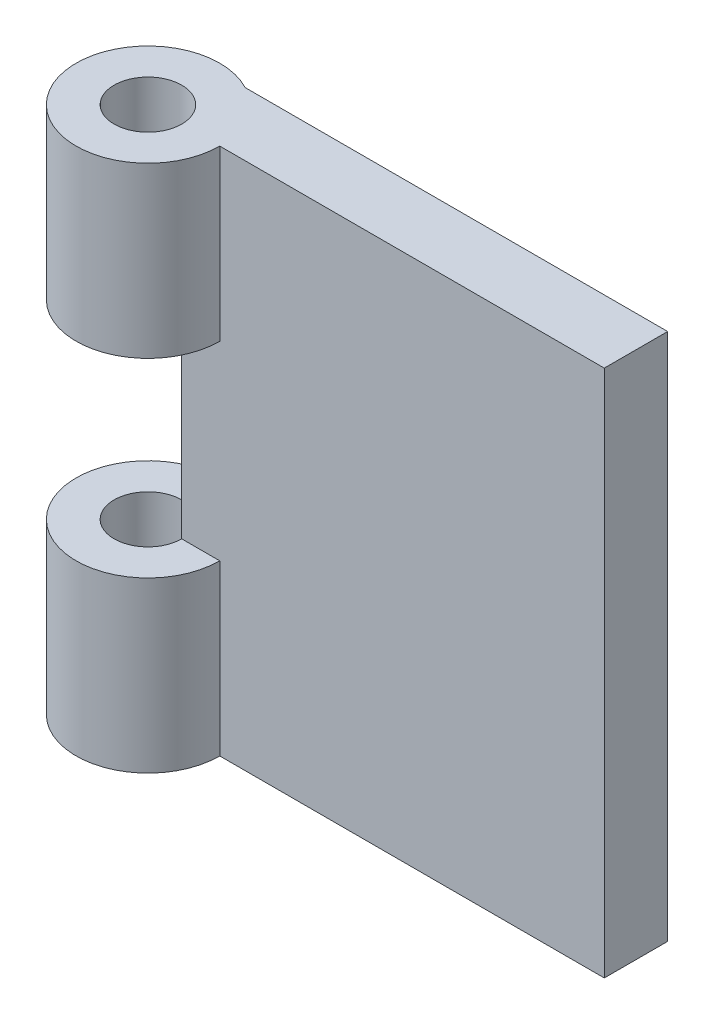
ISO-10303-21;
HEADER;
FILE_DESCRIPTION(('STEP AP214'),'2;1');
FILE_NAME('part.step','',(''),(''),'','','');
FILE_SCHEMA(('AUTOMOTIVE_DESIGN { 1 0 10303 214 1 1 1 1 }'));
ENDSEC;
DATA;
#1=APPLICATION_CONTEXT('core data for automotive mechanical design processes');
#2=APPLICATION_PROTOCOL_DEFINITION('international standard','automotive_design',2000,#1);
#3=PRODUCT_CONTEXT('',#1,'mechanical');
#4=PRODUCT('Part','Part','',(#3));
#5=PRODUCT_RELATED_PRODUCT_CATEGORY('part','',(#4));
#6=PRODUCT_DEFINITION_FORMATION('','',#4);
#7=PRODUCT_DEFINITION_CONTEXT('part definition',#1,'design');
#8=PRODUCT_DEFINITION('design','',#6,#7);
#9=PRODUCT_DEFINITION_SHAPE('','',#8);
#10=(LENGTH_UNIT() NAMED_UNIT(*) SI_UNIT(.MILLI.,.METRE.));
#11=(NAMED_UNIT(*) PLANE_ANGLE_UNIT() SI_UNIT($,.RADIAN.));
#12=(NAMED_UNIT(*) SI_UNIT($,.STERADIAN.) SOLID_ANGLE_UNIT());
#13=UNCERTAINTY_MEASURE_WITH_UNIT(LENGTH_MEASURE(1.E-05),#10,'distance_accuracy_value','');
#14=(GEOMETRIC_REPRESENTATION_CONTEXT(3) GLOBAL_UNCERTAINTY_ASSIGNED_CONTEXT((#13)) GLOBAL_UNIT_ASSIGNED_CONTEXT((#10,
#11,#12)) REPRESENTATION_CONTEXT('',''));
#15=CARTESIAN_POINT('',(0.,0.,0.));
#16=DIRECTION('',(0.,0.,1.));
#17=DIRECTION('',(1.,0.,0.));
#18=AXIS2_PLACEMENT_3D('',#15,#16,#17);
#19=CARTESIAN_POINT('',(-10.,-12.5,3.));
#20=DIRECTION('',(1.,0.,0.));
#21=DIRECTION('',(0.,0.,-1.));
#22=AXIS2_PLACEMENT_3D('',#19,#20,#21);
#23=PLANE('',#22);
#24=DIRECTION('',(0.,-1.,0.));
#25=VECTOR('',#24,1.);
#26=CARTESIAN_POINT('',(-10.,-12.5,0.));
#27=LINE('',#26,#25);
#28=CARTESIAN_POINT('',(-9.99999999999999,4.5,0.));
#29=VERTEX_POINT('',#28);
#30=CARTESIAN_POINT('',(-10.,-4.5,0.));
#31=VERTEX_POINT('',#30);
#32=EDGE_CURVE('E120',#29,#31,#27,.T.);
#33=ORIENTED_EDGE('',*,*,#32,.T.);
#34=DIRECTION('',(0.,0.,1.));
#35=VECTOR('',#34,1.);
#36=CARTESIAN_POINT('',(-10.,-4.5,3.));
#37=LINE('',#36,#35);
#38=CARTESIAN_POINT('',(-10.,-4.5,3.));
#39=VERTEX_POINT('',#38);
#40=EDGE_CURVE('E127',#31,#39,#37,.T.);
#41=ORIENTED_EDGE('',*,*,#40,.T.);
#42=DIRECTION('',(0.,-1.,0.));
#43=VECTOR('',#42,1.);
#44=CARTESIAN_POINT('',(-10.,-12.5,3.));
#45=LINE('',#44,#43);
#46=CARTESIAN_POINT('',(-10.,4.5,3.));
#47=VERTEX_POINT('',#46);
#48=EDGE_CURVE('E159',#47,#39,#45,.T.);
#49=ORIENTED_EDGE('',*,*,#48,.F.);
#50=DIRECTION('',(0.,0.,1.));
#51=VECTOR('',#50,1.);
#52=CARTESIAN_POINT('',(-10.,4.5,3.));
#53=LINE('',#52,#51);
#54=EDGE_CURVE('E151',#29,#47,#53,.T.);
#55=ORIENTED_EDGE('',*,*,#54,.F.);
#56=EDGE_LOOP('',(#33,#41,#49,#55));
#57=FACE_BOUND('',#56,.T.);
#58=ADVANCED_FACE('F44',(#57),#23,.F.);
#59=CARTESIAN_POINT('',(-10.,12.5,3.));
#60=DIRECTION('',(0.,-1.,0.));
#61=DIRECTION('',(0.,0.,-1.));
#62=AXIS2_PLACEMENT_3D('',#59,#60,#61);
#63=PLANE('',#62);
#64=DIRECTION('',(-1.,0.,0.));
#65=VECTOR('',#64,1.);
#66=CARTESIAN_POINT('',(-10.,12.5,0.));
#67=LINE('',#66,#65);
#68=CARTESIAN_POINT('',(10.,12.5,0.));
#69=VERTEX_POINT('',#68);
#70=CARTESIAN_POINT('',(-10.,12.5,0.));
#71=VERTEX_POINT('',#70);
#72=EDGE_CURVE('E121',#69,#71,#67,.T.);
#73=ORIENTED_EDGE('',*,*,#72,.T.);
#74=CARTESIAN_POINT('',(-11.6,12.5,3.));
#75=DIRECTION('',(0.,1.,0.));
#76=DIRECTION('',(0.,0.,1.));
#77=AXIS2_PLACEMENT_3D('',#74,#75,#76);
#78=CIRCLE('',#77,3.4);
#79=CARTESIAN_POINT('',(-8.19999999999999,12.5,3.));
#80=VERTEX_POINT('',#79);
#81=EDGE_CURVE('E141',#71,#80,#78,.T.);
#82=ORIENTED_EDGE('',*,*,#81,.T.);
#83=DIRECTION('',(-1.,0.,0.));
#84=VECTOR('',#83,1.);
#85=CARTESIAN_POINT('',(-10.,12.5,3.));
#86=LINE('',#85,#84);
#87=CARTESIAN_POINT('',(10.,12.5,3.));
#88=VERTEX_POINT('',#87);
#89=EDGE_CURVE('E157',#88,#80,#86,.T.);
#90=ORIENTED_EDGE('',*,*,#89,.F.);
#91=DIRECTION('',(0.,0.,-1.));
#92=VECTOR('',#91,1.);
#93=CARTESIAN_POINT('',(10.,12.5,3.));
#94=LINE('',#93,#92);
#95=EDGE_CURVE('E52',#88,#69,#94,.T.);
#96=ORIENTED_EDGE('',*,*,#95,.T.);
#97=EDGE_LOOP('',(#73,#82,#90,#96));
#98=FACE_BOUND('',#97,.T.);
#99=CARTESIAN_POINT('',(-11.6,12.5,3.));
#100=DIRECTION('',(0.,1.,0.));
#101=DIRECTION('',(0.,0.,1.));
#102=AXIS2_PLACEMENT_3D('',#99,#100,#101);
#103=CIRCLE('',#102,1.60000000000001);
#104=CARTESIAN_POINT('',(-11.6,12.5,4.6));
#105=VERTEX_POINT('',#104);
#106=EDGE_CURVE('E137',#105,#105,#103,.T.);
#107=ORIENTED_EDGE('',*,*,#106,.F.);
#108=EDGE_LOOP('',(#107));
#109=FACE_BOUND('',#108,.T.);
#110=ADVANCED_FACE('F46',(#98,#109),#63,.F.);
#111=CARTESIAN_POINT('',(-10.,-12.5,3.));
#112=DIRECTION('',(0.,1.,0.));
#113=DIRECTION('',(0.,0.,1.));
#114=AXIS2_PLACEMENT_3D('',#111,#112,#113);
#115=PLANE('',#114);
#116=CARTESIAN_POINT('',(-11.6,-12.5,3.));
#117=DIRECTION('',(0.,1.,0.));
#118=DIRECTION('',(0.,0.,1.));
#119=AXIS2_PLACEMENT_3D('',#116,#117,#118);
#120=CIRCLE('',#119,3.4);
#121=CARTESIAN_POINT('',(-9.99999999999999,-12.5,0.));
#122=VERTEX_POINT('',#121);
#123=CARTESIAN_POINT('',(-8.19999999999999,-12.5,3.));
#124=VERTEX_POINT('',#123);
#125=EDGE_CURVE('E117',#122,#124,#120,.T.);
#126=ORIENTED_EDGE('',*,*,#125,.F.);
#127=DIRECTION('',(1.,0.,0.));
#128=VECTOR('',#127,1.);
#129=CARTESIAN_POINT('',(-10.,-12.5,0.));
#130=LINE('',#129,#128);
#131=CARTESIAN_POINT('',(10.,-12.5,0.));
#132=VERTEX_POINT('',#131);
#133=EDGE_CURVE('E101',#122,#132,#130,.T.);
#134=ORIENTED_EDGE('',*,*,#133,.T.);
#135=DIRECTION('',(0.,0.,-1.));
#136=VECTOR('',#135,1.);
#137=CARTESIAN_POINT('',(10.,-12.5,3.));
#138=LINE('',#137,#136);
#139=CARTESIAN_POINT('',(10.,-12.5,3.));
#140=VERTEX_POINT('',#139);
#141=EDGE_CURVE('E11',#140,#132,#138,.T.);
#142=ORIENTED_EDGE('',*,*,#141,.F.);
#143=DIRECTION('',(1.,0.,0.));
#144=VECTOR('',#143,1.);
#145=CARTESIAN_POINT('',(-10.,-12.5,3.));
#146=LINE('',#145,#144);
#147=EDGE_CURVE('E125',#124,#140,#146,.T.);
#148=ORIENTED_EDGE('',*,*,#147,.F.);
#149=EDGE_LOOP('',(#126,#134,#142,#148));
#150=FACE_BOUND('',#149,.T.);
#151=CARTESIAN_POINT('',(-11.6,-12.5,3.));
#152=DIRECTION('',(0.,1.,0.));
#153=DIRECTION('',(0.,0.,1.));
#154=AXIS2_PLACEMENT_3D('',#151,#152,#153);
#155=CIRCLE('',#154,1.60000000000001);
#156=CARTESIAN_POINT('',(-11.6,-12.5,4.6));
#157=VERTEX_POINT('',#156);
#158=EDGE_CURVE('E129',#157,#157,#155,.T.);
#159=ORIENTED_EDGE('',*,*,#158,.T.);
#160=EDGE_LOOP('',(#159));
#161=FACE_BOUND('',#160,.T.);
#162=ADVANCED_FACE('F123',(#150,#161),#115,.F.);
#163=CARTESIAN_POINT('',(10.,-12.5,3.));
#164=DIRECTION('',(-1.,0.,0.));
#165=DIRECTION('',(0.,0.,1.));
#166=AXIS2_PLACEMENT_3D('',#163,#164,#165);
#167=PLANE('',#166);
#168=DIRECTION('',(0.,1.,0.));
#169=VECTOR('',#168,1.);
#170=CARTESIAN_POINT('',(10.,-12.5,0.));
#171=LINE('',#170,#169);
#172=EDGE_CURVE('E107',#132,#69,#171,.T.);
#173=ORIENTED_EDGE('',*,*,#172,.T.);
#174=ORIENTED_EDGE('',*,*,#95,.F.);
#175=DIRECTION('',(0.,1.,0.));
#176=VECTOR('',#175,1.);
#177=CARTESIAN_POINT('',(10.,-12.5,3.));
#178=LINE('',#177,#176);
#179=EDGE_CURVE('E162',#140,#88,#178,.T.);
#180=ORIENTED_EDGE('',*,*,#179,.F.);
#181=ORIENTED_EDGE('',*,*,#141,.T.);
#182=EDGE_LOOP('',(#173,#174,#180,#181));
#183=FACE_BOUND('',#182,.T.);
#184=ADVANCED_FACE('F211',(#183),#167,.F.);
#185=CARTESIAN_POINT('',(0.,0.,3.));
#186=DIRECTION('',(0.,0.,1.));
#187=DIRECTION('',(1.,0.,0.));
#188=AXIS2_PLACEMENT_3D('',#185,#186,#187);
#189=PLANE('',#188);
#190=DIRECTION('',(0.,1.,0.));
#191=VECTOR('',#190,1.);
#192=CARTESIAN_POINT('',(-8.19999999999999,-12.5,3.));
#193=LINE('',#192,#191);
#194=CARTESIAN_POINT('',(-8.19999999999999,-4.5,3.));
#195=VERTEX_POINT('',#194);
#196=EDGE_CURVE('E63',#124,#195,#193,.T.);
#197=ORIENTED_EDGE('',*,*,#196,.F.);
#198=ORIENTED_EDGE('',*,*,#147,.T.);
#199=ORIENTED_EDGE('',*,*,#179,.T.);
#200=ORIENTED_EDGE('',*,*,#89,.T.);
#201=DIRECTION('',(0.,1.,0.));
#202=VECTOR('',#201,1.);
#203=CARTESIAN_POINT('',(-8.19999999999999,4.5,3.));
#204=LINE('',#203,#202);
#205=CARTESIAN_POINT('',(-8.19999999999999,4.5,3.));
#206=VERTEX_POINT('',#205);
#207=EDGE_CURVE('E154',#206,#80,#204,.T.);
#208=ORIENTED_EDGE('',*,*,#207,.F.);
#209=DIRECTION('',(-1.,0.,0.));
#210=VECTOR('',#209,1.);
#211=CARTESIAN_POINT('',(0.,4.5,3.));
#212=LINE('',#211,#210);
#213=EDGE_CURVE('E147',#206,#47,#212,.T.);
#214=ORIENTED_EDGE('',*,*,#213,.T.);
#215=ORIENTED_EDGE('',*,*,#48,.T.);
#216=DIRECTION('',(-1.,0.,0.));
#217=VECTOR('',#216,1.);
#218=CARTESIAN_POINT('',(0.,-4.5,3.));
#219=LINE('',#218,#217);
#220=EDGE_CURVE('E59',#195,#39,#219,.T.);
#221=ORIENTED_EDGE('',*,*,#220,.F.);
#222=EDGE_LOOP('',(#197,#198,#199,#200,#208,#214,#215,#221));
#223=FACE_BOUND('',#222,.T.);
#224=ADVANCED_FACE('F184',(#223),#189,.T.);
#225=CARTESIAN_POINT('',(0.,0.,0.));
#226=DIRECTION('',(0.,0.,1.));
#227=DIRECTION('',(1.,0.,0.));
#228=AXIS2_PLACEMENT_3D('',#225,#226,#227);
#229=PLANE('',#228);
#230=ORIENTED_EDGE('',*,*,#72,.F.);
#231=ORIENTED_EDGE('',*,*,#172,.F.);
#232=ORIENTED_EDGE('',*,*,#133,.F.);
#233=EDGE_CURVE('E105',#31,#122,#27,.T.);
#234=ORIENTED_EDGE('',*,*,#233,.F.);
#235=ORIENTED_EDGE('',*,*,#32,.F.);
#236=EDGE_CURVE('E111',#71,#29,#27,.T.);
#237=ORIENTED_EDGE('',*,*,#236,.F.);
#238=EDGE_LOOP('',(#230,#231,#232,#234,#235,#237));
#239=FACE_BOUND('',#238,.T.);
#240=ADVANCED_FACE('F104',(#239),#229,.F.);
#241=CARTESIAN_POINT('',(-11.6,4.5,3.));
#242=DIRECTION('',(0.,1.,0.));
#243=DIRECTION('',(0.,0.,1.));
#244=AXIS2_PLACEMENT_3D('',#241,#242,#243);
#245=PLANE('',#244);
#246=CARTESIAN_POINT('',(-11.6,4.5,3.));
#247=DIRECTION('',(0.,1.,0.));
#248=DIRECTION('',(0.,0.,1.));
#249=AXIS2_PLACEMENT_3D('',#246,#247,#248);
#250=CIRCLE('',#249,3.4);
#251=EDGE_CURVE('E144',#29,#206,#250,.T.);
#252=ORIENTED_EDGE('',*,*,#251,.F.);
#253=ORIENTED_EDGE('',*,*,#54,.T.);
#254=CARTESIAN_POINT('',(-11.6,4.5,3.));
#255=DIRECTION('',(0.,1.,0.));
#256=DIRECTION('',(0.,0.,1.));
#257=AXIS2_PLACEMENT_3D('',#254,#255,#256);
#258=CIRCLE('',#257,1.60000000000001);
#259=EDGE_CURVE('E138',#47,#47,#258,.T.);
#260=ORIENTED_EDGE('',*,*,#259,.T.);
#261=ORIENTED_EDGE('',*,*,#213,.F.);
#262=EDGE_LOOP('',(#252,#253,#260,#261));
#263=FACE_BOUND('',#262,.T.);
#264=ADVANCED_FACE('F181',(#263),#245,.F.);
#265=CARTESIAN_POINT('',(-11.6,4.5,3.));
#266=DIRECTION('',(0.,1.,0.));
#267=DIRECTION('',(0.,0.,1.));
#268=AXIS2_PLACEMENT_3D('',#265,#266,#267);
#269=CYLINDRICAL_SURFACE('',#268,3.4);
#270=ORIENTED_EDGE('',*,*,#251,.T.);
#271=ORIENTED_EDGE('',*,*,#207,.T.);
#272=ORIENTED_EDGE('',*,*,#81,.F.);
#273=ORIENTED_EDGE('',*,*,#236,.T.);
#274=EDGE_LOOP('',(#270,#271,#272,#273));
#275=FACE_BOUND('',#274,.T.);
#276=ADVANCED_FACE('F178',(#275),#269,.T.);
#277=CARTESIAN_POINT('',(-11.6,4.5,3.));
#278=DIRECTION('',(0.,1.,0.));
#279=DIRECTION('',(0.,0.,1.));
#280=AXIS2_PLACEMENT_3D('',#277,#278,#279);
#281=CYLINDRICAL_SURFACE('',#280,1.60000000000001);
#282=ORIENTED_EDGE('',*,*,#106,.T.);
#283=EDGE_LOOP('',(#282));
#284=FACE_BOUND('',#283,.T.);
#285=ORIENTED_EDGE('',*,*,#259,.F.);
#286=EDGE_LOOP('',(#285));
#287=FACE_BOUND('',#286,.T.);
#288=ADVANCED_FACE('F220',(#284,#287),#281,.F.);
#289=CARTESIAN_POINT('',(-11.6,-4.5,3.));
#290=DIRECTION('',(0.,1.,0.));
#291=DIRECTION('',(0.,0.,1.));
#292=AXIS2_PLACEMENT_3D('',#289,#290,#291);
#293=PLANE('',#292);
#294=ORIENTED_EDGE('',*,*,#40,.F.);
#295=CARTESIAN_POINT('',(-11.6,-4.5,3.));
#296=DIRECTION('',(0.,1.,0.));
#297=DIRECTION('',(0.,0.,1.));
#298=AXIS2_PLACEMENT_3D('',#295,#296,#297);
#299=CIRCLE('',#298,3.4);
#300=EDGE_CURVE('E119',#31,#195,#299,.T.);
#301=ORIENTED_EDGE('',*,*,#300,.T.);
#302=ORIENTED_EDGE('',*,*,#220,.T.);
#303=CARTESIAN_POINT('',(-11.6,-4.5,3.));
#304=DIRECTION('',(0.,1.,0.));
#305=DIRECTION('',(0.,0.,1.));
#306=AXIS2_PLACEMENT_3D('',#303,#304,#305);
#307=CIRCLE('',#306,1.60000000000001);
#308=EDGE_CURVE('E132',#39,#39,#307,.T.);
#309=ORIENTED_EDGE('',*,*,#308,.F.);
#310=EDGE_LOOP('',(#294,#301,#302,#309));
#311=FACE_BOUND('',#310,.T.);
#312=ADVANCED_FACE('F189',(#311),#293,.T.);
#313=CARTESIAN_POINT('',(-11.6,-12.5,3.));
#314=DIRECTION('',(0.,1.,0.));
#315=DIRECTION('',(0.,0.,1.));
#316=AXIS2_PLACEMENT_3D('',#313,#314,#315);
#317=CYLINDRICAL_SURFACE('',#316,3.4);
#318=ORIENTED_EDGE('',*,*,#125,.T.);
#319=ORIENTED_EDGE('',*,*,#196,.T.);
#320=ORIENTED_EDGE('',*,*,#300,.F.);
#321=ORIENTED_EDGE('',*,*,#233,.T.);
#322=EDGE_LOOP('',(#318,#319,#320,#321));
#323=FACE_BOUND('',#322,.T.);
#324=ADVANCED_FACE('F116',(#323),#317,.T.);
#325=CARTESIAN_POINT('',(-11.6,-12.5,3.));
#326=DIRECTION('',(0.,1.,0.));
#327=DIRECTION('',(0.,0.,1.));
#328=AXIS2_PLACEMENT_3D('',#325,#326,#327);
#329=CYLINDRICAL_SURFACE('',#328,1.60000000000001);
#330=ORIENTED_EDGE('',*,*,#308,.T.);
#331=EDGE_LOOP('',(#330));
#332=FACE_BOUND('',#331,.T.);
#333=ORIENTED_EDGE('',*,*,#158,.F.);
#334=EDGE_LOOP('',(#333));
#335=FACE_BOUND('',#334,.T.);
#336=ADVANCED_FACE('F195',(#332,#335),#329,.F.);
#337=CLOSED_SHELL('',(#58,#110,#162,#184,#224,#240,#264,#276,#288,#312,#324,#336));
#338=MANIFOLD_SOLID_BREP('B2',#337);
#339=ADVANCED_BREP_SHAPE_REPRESENTATION('',(#18,#338),#14);
#340=SHAPE_DEFINITION_REPRESENTATION(#9,#339);
ENDSEC;
END-ISO-10303-21;
